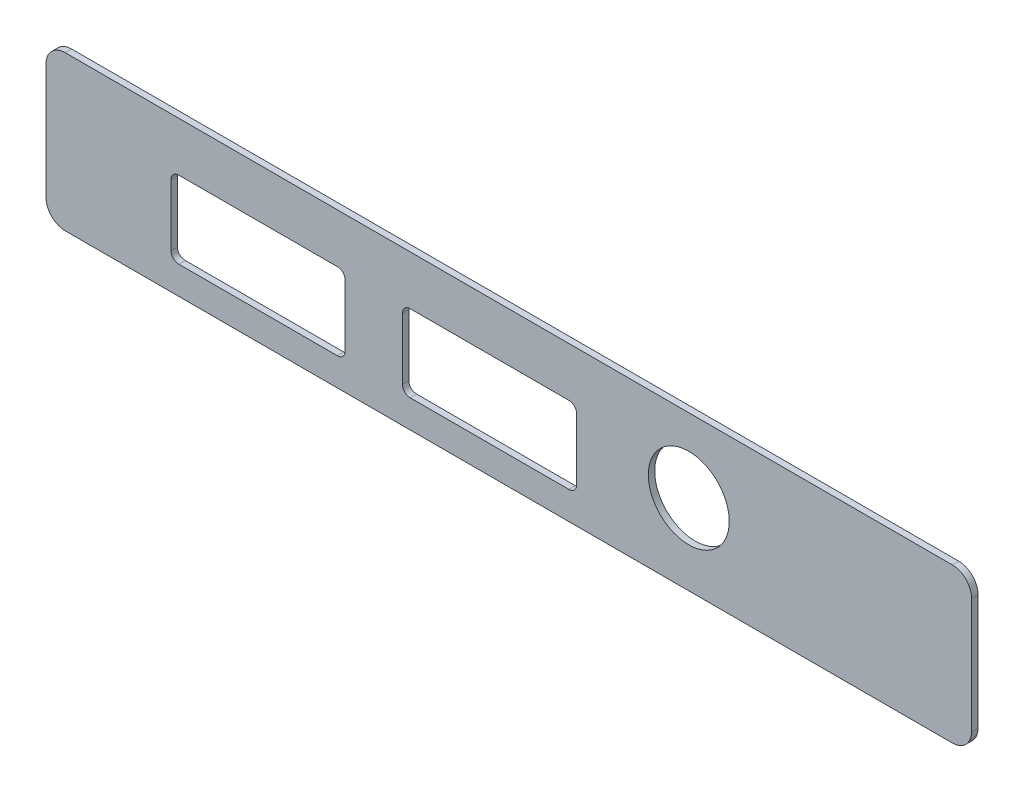
ISO-10303-21;
HEADER;
FILE_DESCRIPTION(('STEP AP214'),'2;1');
FILE_NAME('part.step','',(''),(''),'','','');
FILE_SCHEMA(('AUTOMOTIVE_DESIGN { 1 0 10303 214 1 1 1 1 }'));
ENDSEC;
DATA;
#1=APPLICATION_CONTEXT('core data for automotive mechanical design processes');
#2=APPLICATION_PROTOCOL_DEFINITION('international standard','automotive_design',2000,#1);
#3=PRODUCT_CONTEXT('',#1,'mechanical');
#4=PRODUCT('Part','Part','',(#3));
#5=PRODUCT_RELATED_PRODUCT_CATEGORY('part','',(#4));
#6=PRODUCT_DEFINITION_FORMATION('','',#4);
#7=PRODUCT_DEFINITION_CONTEXT('part definition',#1,'design');
#8=PRODUCT_DEFINITION('design','',#6,#7);
#9=PRODUCT_DEFINITION_SHAPE('','',#8);
#10=(LENGTH_UNIT() NAMED_UNIT(*) SI_UNIT(.MILLI.,.METRE.));
#11=(NAMED_UNIT(*) PLANE_ANGLE_UNIT() SI_UNIT($,.RADIAN.));
#12=(NAMED_UNIT(*) SI_UNIT($,.STERADIAN.) SOLID_ANGLE_UNIT());
#13=UNCERTAINTY_MEASURE_WITH_UNIT(LENGTH_MEASURE(1.E-05),#10,'distance_accuracy_value','');
#14=(GEOMETRIC_REPRESENTATION_CONTEXT(3) GLOBAL_UNCERTAINTY_ASSIGNED_CONTEXT((#13)) GLOBAL_UNIT_ASSIGNED_CONTEXT((#10,
#11,#12)) REPRESENTATION_CONTEXT('',''));
#15=CARTESIAN_POINT('',(0.,0.,0.));
#16=DIRECTION('',(0.,0.,1.));
#17=DIRECTION('',(1.,0.,0.));
#18=AXIS2_PLACEMENT_3D('',#15,#16,#17);
#19=CARTESIAN_POINT('',(0.,0.,55.5));
#20=DIRECTION('',(0.,0.,1.));
#21=DIRECTION('',(1.,0.,0.));
#22=AXIS2_PLACEMENT_3D('',#19,#20,#21);
#23=PLANE('',#22);
#24=DIRECTION('',(0.,1.,0.));
#25=VECTOR('',#24,1.);
#26=CARTESIAN_POINT('',(36.,4.5,55.5));
#27=LINE('',#26,#25);
#28=CARTESIAN_POINT('',(36.,13.5,55.5));
#29=VERTEX_POINT('',#28);
#30=CARTESIAN_POINT('',(36.,4.5,55.5));
#31=VERTEX_POINT('',#30);
#32=EDGE_CURVE('E385',#29,#31,#27,.F.);
#33=ORIENTED_EDGE('',*,*,#32,.F.);
#34=CARTESIAN_POINT('',(34.5,13.5,55.5));
#35=DIRECTION('',(0.,0.,1.));
#36=DIRECTION('',(1.,0.,0.));
#37=AXIS2_PLACEMENT_3D('',#34,#35,#36);
#38=CIRCLE('',#37,1.5);
#39=CARTESIAN_POINT('',(34.5,15.,55.5));
#40=VERTEX_POINT('',#39);
#41=EDGE_CURVE('E322',#40,#29,#38,.F.);
#42=ORIENTED_EDGE('',*,*,#41,.F.);
#43=DIRECTION('',(1.,0.,0.));
#44=VECTOR('',#43,1.);
#45=CARTESIAN_POINT('',(34.5,15.,55.5));
#46=LINE('',#45,#44);
#47=CARTESIAN_POINT('',(-34.5,15.,55.5));
#48=VERTEX_POINT('',#47);
#49=EDGE_CURVE('E339',#48,#40,#46,.T.);
#50=ORIENTED_EDGE('',*,*,#49,.F.);
#51=CARTESIAN_POINT('',(-34.5,13.5,55.5));
#52=DIRECTION('',(0.,0.,1.));
#53=DIRECTION('',(1.,0.,0.));
#54=AXIS2_PLACEMENT_3D('',#51,#52,#53);
#55=CIRCLE('',#54,1.5);
#56=CARTESIAN_POINT('',(-36.,13.5,55.5));
#57=VERTEX_POINT('',#56);
#58=EDGE_CURVE('E335',#57,#48,#55,.F.);
#59=ORIENTED_EDGE('',*,*,#58,.F.);
#60=DIRECTION('',(0.,1.,0.));
#61=VECTOR('',#60,1.);
#62=CARTESIAN_POINT('',(-36.,13.5,55.5));
#63=LINE('',#62,#61);
#64=CARTESIAN_POINT('',(-36.,4.5,55.5));
#65=VERTEX_POINT('',#64);
#66=EDGE_CURVE('E394',#65,#57,#63,.T.);
#67=ORIENTED_EDGE('',*,*,#66,.F.);
#68=CARTESIAN_POINT('',(-34.5,4.5,55.5));
#69=DIRECTION('',(0.,0.,1.));
#70=DIRECTION('',(1.,0.,0.));
#71=AXIS2_PLACEMENT_3D('',#68,#69,#70);
#72=CIRCLE('',#71,1.5);
#73=CARTESIAN_POINT('',(-34.5,3.,55.5));
#74=VERTEX_POINT('',#73);
#75=EDGE_CURVE('E330',#74,#65,#72,.F.);
#76=ORIENTED_EDGE('',*,*,#75,.F.);
#77=DIRECTION('',(1.,0.,0.));
#78=VECTOR('',#77,1.);
#79=CARTESIAN_POINT('',(-34.5,3.,55.5));
#80=LINE('',#79,#78);
#81=CARTESIAN_POINT('',(34.5,3.,55.5));
#82=VERTEX_POINT('',#81);
#83=EDGE_CURVE('E391',#82,#74,#80,.F.);
#84=ORIENTED_EDGE('',*,*,#83,.F.);
#85=CARTESIAN_POINT('',(34.5,4.5,55.5));
#86=DIRECTION('',(0.,0.,1.));
#87=DIRECTION('',(1.,0.,0.));
#88=AXIS2_PLACEMENT_3D('',#85,#86,#87);
#89=CIRCLE('',#88,1.5);
#90=EDGE_CURVE('E325',#31,#82,#89,.F.);
#91=ORIENTED_EDGE('',*,*,#90,.F.);
#92=EDGE_LOOP('',(#33,#42,#50,#59,#67,#76,#84,#91));
#93=FACE_BOUND('',#92,.T.);
#94=CARTESIAN_POINT('',(14.,9.25,55.5));
#95=DIRECTION('',(0.,0.,1.));
#96=DIRECTION('',(1.,0.,0.));
#97=AXIS2_PLACEMENT_3D('',#94,#95,#96);
#98=CIRCLE('',#97,3.15);
#99=CARTESIAN_POINT('',(17.15,9.25,55.5));
#100=VERTEX_POINT('',#99);
#101=EDGE_CURVE('E340',#100,#100,#98,.F.);
#102=ORIENTED_EDGE('',*,*,#101,.T.);
#103=EDGE_LOOP('',(#102));
#104=FACE_BOUND('',#103,.T.);
#105=CARTESIAN_POINT('',(4.675,10.57,55.5));
#106=DIRECTION('',(0.,0.,-1.));
#107=DIRECTION('',(-1.,0.,0.));
#108=AXIS2_PLACEMENT_3D('',#105,#106,#107);
#109=CIRCLE('',#108,0.6);
#110=CARTESIAN_POINT('',(4.675,11.17,55.5));
#111=VERTEX_POINT('',#110);
#112=CARTESIAN_POINT('',(5.275,10.57,55.5));
#113=VERTEX_POINT('',#112);
#114=EDGE_CURVE('E362',#111,#113,#109,.T.);
#115=ORIENTED_EDGE('',*,*,#114,.T.);
#116=DIRECTION('',(0.,1.,0.));
#117=VECTOR('',#116,1.);
#118=CARTESIAN_POINT('',(5.275,5.17,55.5));
#119=LINE('',#118,#117);
#120=CARTESIAN_POINT('',(5.275,5.77,55.5));
#121=VERTEX_POINT('',#120);
#122=EDGE_CURVE('E251',#113,#121,#119,.F.);
#123=ORIENTED_EDGE('',*,*,#122,.T.);
#124=CARTESIAN_POINT('',(4.675,5.77,55.5));
#125=DIRECTION('',(0.,0.,-1.));
#126=DIRECTION('',(-1.,0.,0.));
#127=AXIS2_PLACEMENT_3D('',#124,#125,#126);
#128=CIRCLE('',#127,0.6);
#129=CARTESIAN_POINT('',(4.675,5.17,55.5));
#130=VERTEX_POINT('',#129);
#131=EDGE_CURVE('E356',#121,#130,#128,.T.);
#132=ORIENTED_EDGE('',*,*,#131,.T.);
#133=DIRECTION('',(1.,0.,0.));
#134=VECTOR('',#133,1.);
#135=CARTESIAN_POINT('',(-8.275,5.17,55.5));
#136=LINE('',#135,#134);
#137=CARTESIAN_POINT('',(-7.675,5.17,55.5));
#138=VERTEX_POINT('',#137);
#139=EDGE_CURVE('E360',#130,#138,#136,.F.);
#140=ORIENTED_EDGE('',*,*,#139,.T.);
#141=CARTESIAN_POINT('',(-7.675,5.77,55.5));
#142=DIRECTION('',(0.,0.,-1.));
#143=DIRECTION('',(-1.,0.,0.));
#144=AXIS2_PLACEMENT_3D('',#141,#142,#143);
#145=CIRCLE('',#144,0.600000000000001);
#146=CARTESIAN_POINT('',(-8.275,5.77,55.5));
#147=VERTEX_POINT('',#146);
#148=EDGE_CURVE('E351',#138,#147,#145,.T.);
#149=ORIENTED_EDGE('',*,*,#148,.T.);
#150=DIRECTION('',(0.,1.,0.));
#151=VECTOR('',#150,1.);
#152=CARTESIAN_POINT('',(-8.275,11.17,55.5));
#153=LINE('',#152,#151);
#154=CARTESIAN_POINT('',(-8.275,10.57,55.5));
#155=VERTEX_POINT('',#154);
#156=EDGE_CURVE('E401',#147,#155,#153,.T.);
#157=ORIENTED_EDGE('',*,*,#156,.T.);
#158=CARTESIAN_POINT('',(-7.675,10.57,55.5));
#159=DIRECTION('',(0.,0.,-1.));
#160=DIRECTION('',(-1.,0.,0.));
#161=AXIS2_PLACEMENT_3D('',#158,#159,#160);
#162=CIRCLE('',#161,0.600000000000001);
#163=CARTESIAN_POINT('',(-7.675,11.17,55.5));
#164=VERTEX_POINT('',#163);
#165=EDGE_CURVE('E345',#155,#164,#162,.T.);
#166=ORIENTED_EDGE('',*,*,#165,.T.);
#167=DIRECTION('',(1.,0.,0.));
#168=VECTOR('',#167,1.);
#169=CARTESIAN_POINT('',(5.275,11.17,55.5));
#170=LINE('',#169,#168);
#171=EDGE_CURVE('E349',#164,#111,#170,.T.);
#172=ORIENTED_EDGE('',*,*,#171,.T.);
#173=EDGE_LOOP('',(#115,#123,#132,#140,#149,#157,#166,#172));
#174=FACE_BOUND('',#173,.T.);
#175=CARTESIAN_POINT('',(-13.325,5.77,55.5));
#176=DIRECTION('',(0.,0.,-1.));
#177=DIRECTION('',(-1.,0.,0.));
#178=AXIS2_PLACEMENT_3D('',#175,#176,#177);
#179=CIRCLE('',#178,0.6);
#180=CARTESIAN_POINT('',(-12.725,5.77,55.5));
#181=VERTEX_POINT('',#180);
#182=CARTESIAN_POINT('',(-13.325,5.17,55.5));
#183=VERTEX_POINT('',#182);
#184=EDGE_CURVE('E20',#181,#183,#179,.T.);
#185=ORIENTED_EDGE('',*,*,#184,.T.);
#186=DIRECTION('',(1.,0.,0.));
#187=VECTOR('',#186,1.);
#188=CARTESIAN_POINT('',(-26.275,5.17,55.5));
#189=LINE('',#188,#187);
#190=CARTESIAN_POINT('',(-25.675,5.17,55.5));
#191=VERTEX_POINT('',#190);
#192=EDGE_CURVE('E228',#183,#191,#189,.F.);
#193=ORIENTED_EDGE('',*,*,#192,.T.);
#194=CARTESIAN_POINT('',(-25.675,5.77,55.5));
#195=DIRECTION('',(0.,0.,-1.));
#196=DIRECTION('',(-1.,0.,0.));
#197=AXIS2_PLACEMENT_3D('',#194,#195,#196);
#198=CIRCLE('',#197,0.6);
#199=CARTESIAN_POINT('',(-26.275,5.77,55.5));
#200=VERTEX_POINT('',#199);
#201=EDGE_CURVE('E368',#191,#200,#198,.T.);
#202=ORIENTED_EDGE('',*,*,#201,.T.);
#203=DIRECTION('',(0.,1.,0.));
#204=VECTOR('',#203,1.);
#205=CARTESIAN_POINT('',(-26.275,11.17,55.5));
#206=LINE('',#205,#204);
#207=CARTESIAN_POINT('',(-26.275,10.57,55.5));
#208=VERTEX_POINT('',#207);
#209=EDGE_CURVE('E258',#200,#208,#206,.T.);
#210=ORIENTED_EDGE('',*,*,#209,.T.);
#211=CARTESIAN_POINT('',(-25.675,10.57,55.5));
#212=DIRECTION('',(0.,0.,-1.));
#213=DIRECTION('',(-1.,0.,0.));
#214=AXIS2_PLACEMENT_3D('',#211,#212,#213);
#215=CIRCLE('',#214,0.6);
#216=CARTESIAN_POINT('',(-25.675,11.17,55.5));
#217=VERTEX_POINT('',#216);
#218=EDGE_CURVE('E257',#208,#217,#215,.T.);
#219=ORIENTED_EDGE('',*,*,#218,.T.);
#220=DIRECTION('',(1.,0.,0.));
#221=VECTOR('',#220,1.);
#222=CARTESIAN_POINT('',(-12.725,11.17,55.5));
#223=LINE('',#222,#221);
#224=CARTESIAN_POINT('',(-13.325,11.17,55.5));
#225=VERTEX_POINT('',#224);
#226=EDGE_CURVE('E253',#217,#225,#223,.T.);
#227=ORIENTED_EDGE('',*,*,#226,.T.);
#228=CARTESIAN_POINT('',(-13.325,10.57,55.5));
#229=DIRECTION('',(0.,0.,-1.));
#230=DIRECTION('',(-1.,0.,0.));
#231=AXIS2_PLACEMENT_3D('',#228,#229,#230);
#232=CIRCLE('',#231,0.6);
#233=CARTESIAN_POINT('',(-12.725,10.57,55.5));
#234=VERTEX_POINT('',#233);
#235=EDGE_CURVE('E239',#225,#234,#232,.T.);
#236=ORIENTED_EDGE('',*,*,#235,.T.);
#237=DIRECTION('',(0.,1.,0.));
#238=VECTOR('',#237,1.);
#239=CARTESIAN_POINT('',(-12.725,5.17,55.5));
#240=LINE('',#239,#238);
#241=EDGE_CURVE('E231',#234,#181,#240,.F.);
#242=ORIENTED_EDGE('',*,*,#241,.T.);
#243=EDGE_LOOP('',(#185,#193,#202,#210,#219,#227,#236,#242));
#244=FACE_BOUND('',#243,.T.);
#245=ADVANCED_FACE('F17',(#93,#104,#174,#244),#23,.T.);
#246=CARTESIAN_POINT('',(-13.325,5.77,55.61453877827));
#247=DIRECTION('',(0.,0.,-1.));
#248=DIRECTION('',(-1.,0.,0.));
#249=AXIS2_PLACEMENT_3D('',#246,#247,#248);
#250=CYLINDRICAL_SURFACE('',#249,0.6);
#251=ORIENTED_EDGE('',*,*,#184,.F.);
#252=DIRECTION('',(0.,0.,-1.));
#253=VECTOR('',#252,1.);
#254=CARTESIAN_POINT('',(-12.725,5.77,0.));
#255=LINE('',#254,#253);
#256=CARTESIAN_POINT('',(-12.725,5.77,55.));
#257=VERTEX_POINT('',#256);
#258=EDGE_CURVE('E222',#181,#257,#255,.T.);
#259=ORIENTED_EDGE('',*,*,#258,.T.);
#260=CARTESIAN_POINT('',(-13.325,5.77,55.));
#261=DIRECTION('',(0.,0.,-1.));
#262=DIRECTION('',(-1.,0.,0.));
#263=AXIS2_PLACEMENT_3D('',#260,#261,#262);
#264=CIRCLE('',#263,0.6);
#265=CARTESIAN_POINT('',(-13.325,5.17,55.));
#266=VERTEX_POINT('',#265);
#267=EDGE_CURVE('E319',#257,#266,#264,.T.);
#268=ORIENTED_EDGE('',*,*,#267,.T.);
#269=DIRECTION('',(0.,0.,-1.));
#270=VECTOR('',#269,1.);
#271=CARTESIAN_POINT('',(-13.325,5.17,0.));
#272=LINE('',#271,#270);
#273=EDGE_CURVE('E224',#266,#183,#272,.F.);
#274=ORIENTED_EDGE('',*,*,#273,.T.);
#275=EDGE_LOOP('',(#251,#259,#268,#274));
#276=FACE_BOUND('',#275,.T.);
#277=ADVANCED_FACE('F220',(#276),#250,.F.);
#278=CARTESIAN_POINT('',(-26.275,5.17,0.));
#279=DIRECTION('',(0.,-1.,0.));
#280=DIRECTION('',(0.,0.,-1.));
#281=AXIS2_PLACEMENT_3D('',#278,#279,#280);
#282=PLANE('',#281);
#283=DIRECTION('',(1.,0.,0.));
#284=VECTOR('',#283,1.);
#285=CARTESIAN_POINT('',(0.,5.17,55.));
#286=LINE('',#285,#284);
#287=CARTESIAN_POINT('',(-25.675,5.17,55.));
#288=VERTEX_POINT('',#287);
#289=EDGE_CURVE('E318',#266,#288,#286,.F.);
#290=ORIENTED_EDGE('',*,*,#289,.T.);
#291=DIRECTION('',(0.,0.,-1.));
#292=VECTOR('',#291,1.);
#293=CARTESIAN_POINT('',(-25.675,5.17,55.61453877827));
#294=LINE('',#293,#292);
#295=EDGE_CURVE('E370',#288,#191,#294,.F.);
#296=ORIENTED_EDGE('',*,*,#295,.T.);
#297=ORIENTED_EDGE('',*,*,#192,.F.);
#298=ORIENTED_EDGE('',*,*,#273,.F.);
#299=EDGE_LOOP('',(#290,#296,#297,#298));
#300=FACE_BOUND('',#299,.T.);
#301=ADVANCED_FACE('F729',(#300),#282,.F.);
#302=CARTESIAN_POINT('',(-25.675,5.77,55.61453877827));
#303=DIRECTION('',(0.,0.,-1.));
#304=DIRECTION('',(-1.,0.,0.));
#305=AXIS2_PLACEMENT_3D('',#302,#303,#304);
#306=CYLINDRICAL_SURFACE('',#305,0.6);
#307=ORIENTED_EDGE('',*,*,#201,.F.);
#308=ORIENTED_EDGE('',*,*,#295,.F.);
#309=CARTESIAN_POINT('',(-25.675,5.77,55.));
#310=DIRECTION('',(0.,0.,-1.));
#311=DIRECTION('',(-1.,0.,0.));
#312=AXIS2_PLACEMENT_3D('',#309,#310,#311);
#313=CIRCLE('',#312,0.6);
#314=CARTESIAN_POINT('',(-26.275,5.77,55.));
#315=VERTEX_POINT('',#314);
#316=EDGE_CURVE('E314',#288,#315,#313,.T.);
#317=ORIENTED_EDGE('',*,*,#316,.T.);
#318=DIRECTION('',(0.,0.,1.));
#319=VECTOR('',#318,1.);
#320=CARTESIAN_POINT('',(-26.275,5.77,0.));
#321=LINE('',#320,#319);
#322=EDGE_CURVE('E262',#315,#200,#321,.T.);
#323=ORIENTED_EDGE('',*,*,#322,.T.);
#324=EDGE_LOOP('',(#307,#308,#317,#323));
#325=FACE_BOUND('',#324,.T.);
#326=ADVANCED_FACE('F721',(#325),#306,.F.);
#327=CARTESIAN_POINT('',(-26.275,11.17,0.));
#328=DIRECTION('',(-1.,0.,0.));
#329=DIRECTION('',(0.,0.,1.));
#330=AXIS2_PLACEMENT_3D('',#327,#328,#329);
#331=PLANE('',#330);
#332=ORIENTED_EDGE('',*,*,#209,.F.);
#333=ORIENTED_EDGE('',*,*,#322,.F.);
#334=DIRECTION('',(0.,1.,0.));
#335=VECTOR('',#334,1.);
#336=CARTESIAN_POINT('',(-26.275,0.,55.));
#337=LINE('',#336,#335);
#338=CARTESIAN_POINT('',(-26.275,10.57,55.));
#339=VERTEX_POINT('',#338);
#340=EDGE_CURVE('E313',#315,#339,#337,.T.);
#341=ORIENTED_EDGE('',*,*,#340,.T.);
#342=DIRECTION('',(0.,0.,-1.));
#343=VECTOR('',#342,1.);
#344=CARTESIAN_POINT('',(-26.275,10.57,55.61453877827));
#345=LINE('',#344,#343);
#346=EDGE_CURVE('E261',#339,#208,#345,.F.);
#347=ORIENTED_EDGE('',*,*,#346,.T.);
#348=EDGE_LOOP('',(#332,#333,#341,#347));
#349=FACE_BOUND('',#348,.T.);
#350=ADVANCED_FACE('F436',(#349),#331,.F.);
#351=CARTESIAN_POINT('',(-25.675,10.57,55.61453877827));
#352=DIRECTION('',(0.,0.,-1.));
#353=DIRECTION('',(-1.,0.,0.));
#354=AXIS2_PLACEMENT_3D('',#351,#352,#353);
#355=CYLINDRICAL_SURFACE('',#354,0.6);
#356=ORIENTED_EDGE('',*,*,#218,.F.);
#357=ORIENTED_EDGE('',*,*,#346,.F.);
#358=CARTESIAN_POINT('',(-25.675,10.57,55.));
#359=DIRECTION('',(0.,0.,-1.));
#360=DIRECTION('',(-1.,0.,0.));
#361=AXIS2_PLACEMENT_3D('',#358,#359,#360);
#362=CIRCLE('',#361,0.6);
#363=CARTESIAN_POINT('',(-25.675,11.17,55.));
#364=VERTEX_POINT('',#363);
#365=EDGE_CURVE('E309',#339,#364,#362,.T.);
#366=ORIENTED_EDGE('',*,*,#365,.T.);
#367=DIRECTION('',(0.,0.,1.));
#368=VECTOR('',#367,1.);
#369=CARTESIAN_POINT('',(-25.675,11.17,0.));
#370=LINE('',#369,#368);
#371=EDGE_CURVE('E256',#364,#217,#370,.T.);
#372=ORIENTED_EDGE('',*,*,#371,.T.);
#373=EDGE_LOOP('',(#356,#357,#366,#372));
#374=FACE_BOUND('',#373,.T.);
#375=ADVANCED_FACE('F441',(#374),#355,.F.);
#376=CARTESIAN_POINT('',(-12.725,11.17,0.));
#377=DIRECTION('',(0.,1.,0.));
#378=DIRECTION('',(0.,0.,1.));
#379=AXIS2_PLACEMENT_3D('',#376,#377,#378);
#380=PLANE('',#379);
#381=DIRECTION('',(1.,0.,0.));
#382=VECTOR('',#381,1.);
#383=CARTESIAN_POINT('',(0.,11.17,55.));
#384=LINE('',#383,#382);
#385=CARTESIAN_POINT('',(-13.325,11.17,55.));
#386=VERTEX_POINT('',#385);
#387=EDGE_CURVE('E308',#364,#386,#384,.T.);
#388=ORIENTED_EDGE('',*,*,#387,.T.);
#389=DIRECTION('',(0.,0.,-1.));
#390=VECTOR('',#389,1.);
#391=CARTESIAN_POINT('',(-13.325,11.17,55.61453877827));
#392=LINE('',#391,#390);
#393=EDGE_CURVE('E247',#386,#225,#392,.F.);
#394=ORIENTED_EDGE('',*,*,#393,.T.);
#395=ORIENTED_EDGE('',*,*,#226,.F.);
#396=ORIENTED_EDGE('',*,*,#371,.F.);
#397=EDGE_LOOP('',(#388,#394,#395,#396));
#398=FACE_BOUND('',#397,.T.);
#399=ADVANCED_FACE('F698',(#398),#380,.F.);
#400=CARTESIAN_POINT('',(-13.325,10.57,55.61453877827));
#401=DIRECTION('',(0.,0.,-1.));
#402=DIRECTION('',(-1.,0.,0.));
#403=AXIS2_PLACEMENT_3D('',#400,#401,#402);
#404=CYLINDRICAL_SURFACE('',#403,0.6);
#405=ORIENTED_EDGE('',*,*,#235,.F.);
#406=ORIENTED_EDGE('',*,*,#393,.F.);
#407=CARTESIAN_POINT('',(-13.325,10.57,55.));
#408=DIRECTION('',(0.,0.,-1.));
#409=DIRECTION('',(-1.,0.,0.));
#410=AXIS2_PLACEMENT_3D('',#407,#408,#409);
#411=CIRCLE('',#410,0.6);
#412=CARTESIAN_POINT('',(-12.725,10.57,55.));
#413=VERTEX_POINT('',#412);
#414=EDGE_CURVE('E304',#386,#413,#411,.T.);
#415=ORIENTED_EDGE('',*,*,#414,.T.);
#416=DIRECTION('',(0.,0.,-1.));
#417=VECTOR('',#416,1.);
#418=CARTESIAN_POINT('',(-12.725,10.57,0.));
#419=LINE('',#418,#417);
#420=EDGE_CURVE('E236',#413,#234,#419,.F.);
#421=ORIENTED_EDGE('',*,*,#420,.T.);
#422=EDGE_LOOP('',(#405,#406,#415,#421));
#423=FACE_BOUND('',#422,.T.);
#424=ADVANCED_FACE('F690',(#423),#404,.F.);
#425=CARTESIAN_POINT('',(-12.725,5.17,0.));
#426=DIRECTION('',(1.,0.,0.));
#427=DIRECTION('',(0.,0.,-1.));
#428=AXIS2_PLACEMENT_3D('',#425,#426,#427);
#429=PLANE('',#428);
#430=DIRECTION('',(0.,1.,0.));
#431=VECTOR('',#430,1.);
#432=CARTESIAN_POINT('',(-12.725,0.,55.));
#433=LINE('',#432,#431);
#434=EDGE_CURVE('E234',#413,#257,#433,.F.);
#435=ORIENTED_EDGE('',*,*,#434,.T.);
#436=ORIENTED_EDGE('',*,*,#258,.F.);
#437=ORIENTED_EDGE('',*,*,#241,.F.);
#438=ORIENTED_EDGE('',*,*,#420,.F.);
#439=EDGE_LOOP('',(#435,#436,#437,#438));
#440=FACE_BOUND('',#439,.T.);
#441=ADVANCED_FACE('F230',(#440),#429,.F.);
#442=CARTESIAN_POINT('',(4.675,10.57,55.61453877827));
#443=DIRECTION('',(0.,0.,-1.));
#444=DIRECTION('',(-1.,0.,0.));
#445=AXIS2_PLACEMENT_3D('',#442,#443,#444);
#446=CYLINDRICAL_SURFACE('',#445,0.6);
#447=ORIENTED_EDGE('',*,*,#114,.F.);
#448=DIRECTION('',(0.,0.,1.));
#449=VECTOR('',#448,1.);
#450=CARTESIAN_POINT('',(4.675,11.17,0.));
#451=LINE('',#450,#449);
#452=CARTESIAN_POINT('',(4.675,11.17,55.));
#453=VERTEX_POINT('',#452);
#454=EDGE_CURVE('E400',#111,#453,#451,.F.);
#455=ORIENTED_EDGE('',*,*,#454,.T.);
#456=CARTESIAN_POINT('',(4.675,10.57,55.));
#457=DIRECTION('',(0.,0.,-1.));
#458=DIRECTION('',(-1.,0.,0.));
#459=AXIS2_PLACEMENT_3D('',#456,#457,#458);
#460=CIRCLE('',#459,0.6);
#461=CARTESIAN_POINT('',(5.275,10.57,55.));
#462=VERTEX_POINT('',#461);
#463=EDGE_CURVE('E300',#453,#462,#460,.T.);
#464=ORIENTED_EDGE('',*,*,#463,.T.);
#465=DIRECTION('',(0.,0.,-1.));
#466=VECTOR('',#465,1.);
#467=CARTESIAN_POINT('',(5.275,10.57,0.));
#468=LINE('',#467,#466);
#469=EDGE_CURVE('E421',#462,#113,#468,.F.);
#470=ORIENTED_EDGE('',*,*,#469,.T.);
#471=EDGE_LOOP('',(#447,#455,#464,#470));
#472=FACE_BOUND('',#471,.T.);
#473=ADVANCED_FACE('F508',(#472),#446,.F.);
#474=CARTESIAN_POINT('',(5.275,5.17,0.));
#475=DIRECTION('',(1.,0.,0.));
#476=DIRECTION('',(0.,0.,-1.));
#477=AXIS2_PLACEMENT_3D('',#474,#475,#476);
#478=PLANE('',#477);
#479=DIRECTION('',(0.,1.,0.));
#480=VECTOR('',#479,1.);
#481=CARTESIAN_POINT('',(5.275,0.,55.));
#482=LINE('',#481,#480);
#483=CARTESIAN_POINT('',(5.275,5.77,55.));
#484=VERTEX_POINT('',#483);
#485=EDGE_CURVE('E299',#462,#484,#482,.F.);
#486=ORIENTED_EDGE('',*,*,#485,.T.);
#487=DIRECTION('',(0.,0.,-1.));
#488=VECTOR('',#487,1.);
#489=CARTESIAN_POINT('',(5.275,5.77,55.61453877827));
#490=LINE('',#489,#488);
#491=EDGE_CURVE('E361',#484,#121,#490,.F.);
#492=ORIENTED_EDGE('',*,*,#491,.T.);
#493=ORIENTED_EDGE('',*,*,#122,.F.);
#494=ORIENTED_EDGE('',*,*,#469,.F.);
#495=EDGE_LOOP('',(#486,#492,#493,#494));
#496=FACE_BOUND('',#495,.T.);
#497=ADVANCED_FACE('F505',(#496),#478,.F.);
#498=CARTESIAN_POINT('',(4.675,5.77,55.61453877827));
#499=DIRECTION('',(0.,0.,-1.));
#500=DIRECTION('',(-1.,0.,0.));
#501=AXIS2_PLACEMENT_3D('',#498,#499,#500);
#502=CYLINDRICAL_SURFACE('',#501,0.6);
#503=ORIENTED_EDGE('',*,*,#131,.F.);
#504=ORIENTED_EDGE('',*,*,#491,.F.);
#505=CARTESIAN_POINT('',(4.675,5.77,55.));
#506=DIRECTION('',(0.,0.,-1.));
#507=DIRECTION('',(-1.,0.,0.));
#508=AXIS2_PLACEMENT_3D('',#505,#506,#507);
#509=CIRCLE('',#508,0.6);
#510=CARTESIAN_POINT('',(4.675,5.17,55.));
#511=VERTEX_POINT('',#510);
#512=EDGE_CURVE('E295',#484,#511,#509,.T.);
#513=ORIENTED_EDGE('',*,*,#512,.T.);
#514=DIRECTION('',(0.,0.,-1.));
#515=VECTOR('',#514,1.);
#516=CARTESIAN_POINT('',(4.675,5.17,0.));
#517=LINE('',#516,#515);
#518=EDGE_CURVE('E404',#511,#130,#517,.F.);
#519=ORIENTED_EDGE('',*,*,#518,.T.);
#520=EDGE_LOOP('',(#503,#504,#513,#519));
#521=FACE_BOUND('',#520,.T.);
#522=ADVANCED_FACE('F516',(#521),#502,.F.);
#523=CARTESIAN_POINT('',(-8.275,5.17,0.));
#524=DIRECTION('',(0.,-1.,0.));
#525=DIRECTION('',(0.,0.,-1.));
#526=AXIS2_PLACEMENT_3D('',#523,#524,#525);
#527=PLANE('',#526);
#528=DIRECTION('',(1.,0.,0.));
#529=VECTOR('',#528,1.);
#530=CARTESIAN_POINT('',(0.,5.17,55.));
#531=LINE('',#530,#529);
#532=CARTESIAN_POINT('',(-7.675,5.17,55.));
#533=VERTEX_POINT('',#532);
#534=EDGE_CURVE('E294',#511,#533,#531,.F.);
#535=ORIENTED_EDGE('',*,*,#534,.T.);
#536=DIRECTION('',(0.,0.,-1.));
#537=VECTOR('',#536,1.);
#538=CARTESIAN_POINT('',(-7.675,5.17,55.61453877827));
#539=LINE('',#538,#537);
#540=EDGE_CURVE('E355',#533,#138,#539,.F.);
#541=ORIENTED_EDGE('',*,*,#540,.T.);
#542=ORIENTED_EDGE('',*,*,#139,.F.);
#543=ORIENTED_EDGE('',*,*,#518,.F.);
#544=EDGE_LOOP('',(#535,#541,#542,#543));
#545=FACE_BOUND('',#544,.T.);
#546=ADVANCED_FACE('F518',(#545),#527,.F.);
#547=CARTESIAN_POINT('',(-7.675,5.77,55.61453877827));
#548=DIRECTION('',(0.,0.,-1.));
#549=DIRECTION('',(-1.,0.,0.));
#550=AXIS2_PLACEMENT_3D('',#547,#548,#549);
#551=CYLINDRICAL_SURFACE('',#550,0.600000000000001);
#552=ORIENTED_EDGE('',*,*,#148,.F.);
#553=ORIENTED_EDGE('',*,*,#540,.F.);
#554=CARTESIAN_POINT('',(-7.675,5.77,55.));
#555=DIRECTION('',(0.,0.,-1.));
#556=DIRECTION('',(-1.,0.,0.));
#557=AXIS2_PLACEMENT_3D('',#554,#555,#556);
#558=CIRCLE('',#557,0.600000000000001);
#559=CARTESIAN_POINT('',(-8.275,5.77,55.));
#560=VERTEX_POINT('',#559);
#561=EDGE_CURVE('E290',#533,#560,#558,.T.);
#562=ORIENTED_EDGE('',*,*,#561,.T.);
#563=DIRECTION('',(0.,0.,1.));
#564=VECTOR('',#563,1.);
#565=CARTESIAN_POINT('',(-8.275,5.77,0.));
#566=LINE('',#565,#564);
#567=EDGE_CURVE('E354',#560,#147,#566,.T.);
#568=ORIENTED_EDGE('',*,*,#567,.T.);
#569=EDGE_LOOP('',(#552,#553,#562,#568));
#570=FACE_BOUND('',#569,.T.);
#571=ADVANCED_FACE('F483',(#570),#551,.F.);
#572=CARTESIAN_POINT('',(-8.275,11.17,0.));
#573=DIRECTION('',(-1.,0.,0.));
#574=DIRECTION('',(0.,0.,1.));
#575=AXIS2_PLACEMENT_3D('',#572,#573,#574);
#576=PLANE('',#575);
#577=ORIENTED_EDGE('',*,*,#156,.F.);
#578=ORIENTED_EDGE('',*,*,#567,.F.);
#579=DIRECTION('',(0.,1.,0.));
#580=VECTOR('',#579,1.);
#581=CARTESIAN_POINT('',(-8.275,0.,55.));
#582=LINE('',#581,#580);
#583=CARTESIAN_POINT('',(-8.275,10.57,55.));
#584=VERTEX_POINT('',#583);
#585=EDGE_CURVE('E289',#560,#584,#582,.T.);
#586=ORIENTED_EDGE('',*,*,#585,.T.);
#587=DIRECTION('',(0.,0.,-1.));
#588=VECTOR('',#587,1.);
#589=CARTESIAN_POINT('',(-8.275,10.57,55.61453877827));
#590=LINE('',#589,#588);
#591=EDGE_CURVE('E350',#584,#155,#590,.F.);
#592=ORIENTED_EDGE('',*,*,#591,.T.);
#593=EDGE_LOOP('',(#577,#578,#586,#592));
#594=FACE_BOUND('',#593,.T.);
#595=ADVANCED_FACE('F489',(#594),#576,.F.);
#596=CARTESIAN_POINT('',(-7.675,10.57,55.61453877827));
#597=DIRECTION('',(0.,0.,-1.));
#598=DIRECTION('',(-1.,0.,0.));
#599=AXIS2_PLACEMENT_3D('',#596,#597,#598);
#600=CYLINDRICAL_SURFACE('',#599,0.600000000000001);
#601=ORIENTED_EDGE('',*,*,#165,.F.);
#602=ORIENTED_EDGE('',*,*,#591,.F.);
#603=CARTESIAN_POINT('',(-7.675,10.57,55.));
#604=DIRECTION('',(0.,0.,-1.));
#605=DIRECTION('',(-1.,0.,0.));
#606=AXIS2_PLACEMENT_3D('',#603,#604,#605);
#607=CIRCLE('',#606,0.600000000000001);
#608=CARTESIAN_POINT('',(-7.675,11.17,55.));
#609=VERTEX_POINT('',#608);
#610=EDGE_CURVE('E285',#584,#609,#607,.T.);
#611=ORIENTED_EDGE('',*,*,#610,.T.);
#612=DIRECTION('',(0.,0.,1.));
#613=VECTOR('',#612,1.);
#614=CARTESIAN_POINT('',(-7.675,11.17,0.));
#615=LINE('',#614,#613);
#616=EDGE_CURVE('E344',#609,#164,#615,.T.);
#617=ORIENTED_EDGE('',*,*,#616,.T.);
#618=EDGE_LOOP('',(#601,#602,#611,#617));
#619=FACE_BOUND('',#618,.T.);
#620=ADVANCED_FACE('F574',(#619),#600,.F.);
#621=CARTESIAN_POINT('',(5.275,11.17,0.));
#622=DIRECTION('',(0.,1.,0.));
#623=DIRECTION('',(0.,0.,1.));
#624=AXIS2_PLACEMENT_3D('',#621,#622,#623);
#625=PLANE('',#624);
#626=DIRECTION('',(1.,0.,0.));
#627=VECTOR('',#626,1.);
#628=CARTESIAN_POINT('',(0.,11.17,55.));
#629=LINE('',#628,#627);
#630=EDGE_CURVE('E284',#609,#453,#629,.T.);
#631=ORIENTED_EDGE('',*,*,#630,.T.);
#632=ORIENTED_EDGE('',*,*,#454,.F.);
#633=ORIENTED_EDGE('',*,*,#171,.F.);
#634=ORIENTED_EDGE('',*,*,#616,.F.);
#635=EDGE_LOOP('',(#631,#632,#633,#634));
#636=FACE_BOUND('',#635,.T.);
#637=ADVANCED_FACE('F512',(#636),#625,.F.);
#638=CARTESIAN_POINT('',(14.,9.25,0.));
#639=DIRECTION('',(0.,0.,1.));
#640=DIRECTION('',(1.,0.,0.));
#641=AXIS2_PLACEMENT_3D('',#638,#639,#640);
#642=CYLINDRICAL_SURFACE('',#641,3.15);
#643=CARTESIAN_POINT('',(14.,9.25,55.));
#644=DIRECTION('',(0.,0.,1.));
#645=DIRECTION('',(1.,0.,0.));
#646=AXIS2_PLACEMENT_3D('',#643,#644,#645);
#647=CIRCLE('',#646,3.15);
#648=CARTESIAN_POINT('',(17.15,9.25,55.));
#649=VERTEX_POINT('',#648);
#650=EDGE_CURVE('E280',#649,#649,#647,.F.);
#651=ORIENTED_EDGE('',*,*,#650,.T.);
#652=EDGE_LOOP('',(#651));
#653=FACE_BOUND('',#652,.T.);
#654=ORIENTED_EDGE('',*,*,#101,.F.);
#655=EDGE_LOOP('',(#654));
#656=FACE_BOUND('',#655,.T.);
#657=ADVANCED_FACE('F567',(#653,#656),#642,.F.);
#658=CARTESIAN_POINT('',(34.5,15.,55.5));
#659=DIRECTION('',(0.,1.,0.));
#660=DIRECTION('',(0.,0.,1.));
#661=AXIS2_PLACEMENT_3D('',#658,#659,#660);
#662=PLANE('',#661);
#663=DIRECTION('',(0.,0.,1.));
#664=VECTOR('',#663,1.);
#665=CARTESIAN_POINT('',(34.5,15.,55.5));
#666=LINE('',#665,#664);
#667=CARTESIAN_POINT('',(34.5,15.,55.));
#668=VERTEX_POINT('',#667);
#669=EDGE_CURVE('E324',#668,#40,#666,.T.);
#670=ORIENTED_EDGE('',*,*,#669,.F.);
#671=DIRECTION('',(1.,0.,0.));
#672=VECTOR('',#671,1.);
#673=CARTESIAN_POINT('',(0.,15.,55.));
#674=LINE('',#673,#672);
#675=CARTESIAN_POINT('',(-34.5,15.,55.));
#676=VERTEX_POINT('',#675);
#677=EDGE_CURVE('E279',#668,#676,#674,.F.);
#678=ORIENTED_EDGE('',*,*,#677,.T.);
#679=DIRECTION('',(0.,0.,1.));
#680=VECTOR('',#679,1.);
#681=CARTESIAN_POINT('',(-34.5,15.,55.5));
#682=LINE('',#681,#680);
#683=EDGE_CURVE('E338',#48,#676,#682,.F.);
#684=ORIENTED_EDGE('',*,*,#683,.F.);
#685=ORIENTED_EDGE('',*,*,#49,.T.);
#686=EDGE_LOOP('',(#670,#678,#684,#685));
#687=FACE_BOUND('',#686,.T.);
#688=ADVANCED_FACE('F563',(#687),#662,.T.);
#689=CARTESIAN_POINT('',(-34.5,13.5,55.5));
#690=DIRECTION('',(0.,0.,1.));
#691=DIRECTION('',(1.,0.,0.));
#692=AXIS2_PLACEMENT_3D('',#689,#690,#691);
#693=CYLINDRICAL_SURFACE('',#692,1.5);
#694=ORIENTED_EDGE('',*,*,#683,.T.);
#695=CARTESIAN_POINT('',(-34.5,13.5,55.));
#696=DIRECTION('',(0.,0.,1.));
#697=DIRECTION('',(1.,0.,0.));
#698=AXIS2_PLACEMENT_3D('',#695,#696,#697);
#699=CIRCLE('',#698,1.5);
#700=CARTESIAN_POINT('',(-36.,13.5,55.));
#701=VERTEX_POINT('',#700);
#702=EDGE_CURVE('E275',#676,#701,#699,.T.);
#703=ORIENTED_EDGE('',*,*,#702,.T.);
#704=DIRECTION('',(0.,0.,1.));
#705=VECTOR('',#704,1.);
#706=CARTESIAN_POINT('',(-36.,13.5,55.5));
#707=LINE('',#706,#705);
#708=EDGE_CURVE('E334',#57,#701,#707,.F.);
#709=ORIENTED_EDGE('',*,*,#708,.F.);
#710=ORIENTED_EDGE('',*,*,#58,.T.);
#711=EDGE_LOOP('',(#694,#703,#709,#710));
#712=FACE_BOUND('',#711,.T.);
#713=ADVANCED_FACE('F559',(#712),#693,.T.);
#714=CARTESIAN_POINT('',(-36.,13.5,55.5));
#715=DIRECTION('',(-1.,0.,0.));
#716=DIRECTION('',(0.,0.,1.));
#717=AXIS2_PLACEMENT_3D('',#714,#715,#716);
#718=PLANE('',#717);
#719=ORIENTED_EDGE('',*,*,#708,.T.);
#720=DIRECTION('',(0.,1.,0.));
#721=VECTOR('',#720,1.);
#722=CARTESIAN_POINT('',(-36.,0.,55.));
#723=LINE('',#722,#721);
#724=CARTESIAN_POINT('',(-36.,4.5,55.));
#725=VERTEX_POINT('',#724);
#726=EDGE_CURVE('E274',#701,#725,#723,.F.);
#727=ORIENTED_EDGE('',*,*,#726,.T.);
#728=DIRECTION('',(0.,0.,1.));
#729=VECTOR('',#728,1.);
#730=CARTESIAN_POINT('',(-36.,4.5,55.5));
#731=LINE('',#730,#729);
#732=EDGE_CURVE('E333',#65,#725,#731,.F.);
#733=ORIENTED_EDGE('',*,*,#732,.F.);
#734=ORIENTED_EDGE('',*,*,#66,.T.);
#735=EDGE_LOOP('',(#719,#727,#733,#734));
#736=FACE_BOUND('',#735,.T.);
#737=ADVANCED_FACE('F555',(#736),#718,.T.);
#738=CARTESIAN_POINT('',(-34.5,4.5,55.5));
#739=DIRECTION('',(0.,0.,1.));
#740=DIRECTION('',(1.,0.,0.));
#741=AXIS2_PLACEMENT_3D('',#738,#739,#740);
#742=CYLINDRICAL_SURFACE('',#741,1.5);
#743=ORIENTED_EDGE('',*,*,#732,.T.);
#744=CARTESIAN_POINT('',(-34.5,4.5,55.));
#745=DIRECTION('',(0.,0.,1.));
#746=DIRECTION('',(1.,0.,0.));
#747=AXIS2_PLACEMENT_3D('',#744,#745,#746);
#748=CIRCLE('',#747,1.5);
#749=CARTESIAN_POINT('',(-34.5,3.,55.));
#750=VERTEX_POINT('',#749);
#751=EDGE_CURVE('E270',#725,#750,#748,.T.);
#752=ORIENTED_EDGE('',*,*,#751,.T.);
#753=DIRECTION('',(0.,0.,-1.));
#754=VECTOR('',#753,1.);
#755=CARTESIAN_POINT('',(-34.5,3.,55.5));
#756=LINE('',#755,#754);
#757=EDGE_CURVE('E329',#74,#750,#756,.T.);
#758=ORIENTED_EDGE('',*,*,#757,.F.);
#759=ORIENTED_EDGE('',*,*,#75,.T.);
#760=EDGE_LOOP('',(#743,#752,#758,#759));
#761=FACE_BOUND('',#760,.T.);
#762=ADVANCED_FACE('F551',(#761),#742,.T.);
#763=CARTESIAN_POINT('',(-34.5,3.,55.5));
#764=DIRECTION('',(0.,-1.,0.));
#765=DIRECTION('',(0.,0.,-1.));
#766=AXIS2_PLACEMENT_3D('',#763,#764,#765);
#767=PLANE('',#766);
#768=ORIENTED_EDGE('',*,*,#757,.T.);
#769=DIRECTION('',(1.,0.,0.));
#770=VECTOR('',#769,1.);
#771=CARTESIAN_POINT('',(0.,3.,55.));
#772=LINE('',#771,#770);
#773=CARTESIAN_POINT('',(34.5,3.,55.));
#774=VERTEX_POINT('',#773);
#775=EDGE_CURVE('E269',#750,#774,#772,.T.);
#776=ORIENTED_EDGE('',*,*,#775,.T.);
#777=DIRECTION('',(0.,0.,1.));
#778=VECTOR('',#777,1.);
#779=CARTESIAN_POINT('',(34.5,3.,55.5));
#780=LINE('',#779,#778);
#781=EDGE_CURVE('E328',#82,#774,#780,.F.);
#782=ORIENTED_EDGE('',*,*,#781,.F.);
#783=ORIENTED_EDGE('',*,*,#83,.T.);
#784=EDGE_LOOP('',(#768,#776,#782,#783));
#785=FACE_BOUND('',#784,.T.);
#786=ADVANCED_FACE('F547',(#785),#767,.T.);
#787=CARTESIAN_POINT('',(34.5,4.5,55.5));
#788=DIRECTION('',(0.,0.,1.));
#789=DIRECTION('',(1.,0.,0.));
#790=AXIS2_PLACEMENT_3D('',#787,#788,#789);
#791=CYLINDRICAL_SURFACE('',#790,1.5);
#792=ORIENTED_EDGE('',*,*,#781,.T.);
#793=CARTESIAN_POINT('',(34.5,4.5,55.));
#794=DIRECTION('',(0.,0.,1.));
#795=DIRECTION('',(1.,0.,0.));
#796=AXIS2_PLACEMENT_3D('',#793,#794,#795);
#797=CIRCLE('',#796,1.5);
#798=CARTESIAN_POINT('',(36.,4.5,55.));
#799=VERTEX_POINT('',#798);
#800=EDGE_CURVE('E265',#774,#799,#797,.T.);
#801=ORIENTED_EDGE('',*,*,#800,.T.);
#802=DIRECTION('',(0.,0.,-1.));
#803=VECTOR('',#802,1.);
#804=CARTESIAN_POINT('',(36.,4.5,55.5));
#805=LINE('',#804,#803);
#806=EDGE_CURVE('E388',#31,#799,#805,.T.);
#807=ORIENTED_EDGE('',*,*,#806,.F.);
#808=ORIENTED_EDGE('',*,*,#90,.T.);
#809=EDGE_LOOP('',(#792,#801,#807,#808));
#810=FACE_BOUND('',#809,.T.);
#811=ADVANCED_FACE('F543',(#810),#791,.T.);
#812=CARTESIAN_POINT('',(36.,4.5,55.5));
#813=DIRECTION('',(1.,0.,0.));
#814=DIRECTION('',(0.,0.,-1.));
#815=AXIS2_PLACEMENT_3D('',#812,#813,#814);
#816=PLANE('',#815);
#817=ORIENTED_EDGE('',*,*,#806,.T.);
#818=DIRECTION('',(0.,1.,0.));
#819=VECTOR('',#818,1.);
#820=CARTESIAN_POINT('',(36.,0.,55.));
#821=LINE('',#820,#819);
#822=CARTESIAN_POINT('',(36.,13.5,55.));
#823=VERTEX_POINT('',#822);
#824=EDGE_CURVE('E26',#799,#823,#821,.T.);
#825=ORIENTED_EDGE('',*,*,#824,.T.);
#826=DIRECTION('',(0.,0.,1.));
#827=VECTOR('',#826,1.);
#828=CARTESIAN_POINT('',(36.,13.5,55.5));
#829=LINE('',#828,#827);
#830=EDGE_CURVE('E34',#29,#823,#829,.F.);
#831=ORIENTED_EDGE('',*,*,#830,.F.);
#832=ORIENTED_EDGE('',*,*,#32,.T.);
#833=EDGE_LOOP('',(#817,#825,#831,#832));
#834=FACE_BOUND('',#833,.T.);
#835=ADVANCED_FACE('F536',(#834),#816,.T.);
#836=CARTESIAN_POINT('',(34.5,13.5,55.5));
#837=DIRECTION('',(0.,0.,1.));
#838=DIRECTION('',(1.,0.,0.));
#839=AXIS2_PLACEMENT_3D('',#836,#837,#838);
#840=CYLINDRICAL_SURFACE('',#839,1.5);
#841=ORIENTED_EDGE('',*,*,#830,.T.);
#842=CARTESIAN_POINT('',(34.5,13.5,55.));
#843=DIRECTION('',(0.,0.,1.));
#844=DIRECTION('',(1.,0.,0.));
#845=AXIS2_PLACEMENT_3D('',#842,#843,#844);
#846=CIRCLE('',#845,1.5);
#847=EDGE_CURVE('E11',#823,#668,#846,.T.);
#848=ORIENTED_EDGE('',*,*,#847,.T.);
#849=ORIENTED_EDGE('',*,*,#669,.T.);
#850=ORIENTED_EDGE('',*,*,#41,.T.);
#851=EDGE_LOOP('',(#841,#848,#849,#850));
#852=FACE_BOUND('',#851,.T.);
#853=ADVANCED_FACE('F529',(#852),#840,.T.);
#854=CARTESIAN_POINT('',(0.,0.,55.));
#855=DIRECTION('',(0.,0.,1.));
#856=DIRECTION('',(1.,0.,0.));
#857=AXIS2_PLACEMENT_3D('',#854,#855,#856);
#858=PLANE('',#857);
#859=ORIENTED_EDGE('',*,*,#824,.F.);
#860=ORIENTED_EDGE('',*,*,#800,.F.);
#861=ORIENTED_EDGE('',*,*,#775,.F.);
#862=ORIENTED_EDGE('',*,*,#751,.F.);
#863=ORIENTED_EDGE('',*,*,#726,.F.);
#864=ORIENTED_EDGE('',*,*,#702,.F.);
#865=ORIENTED_EDGE('',*,*,#677,.F.);
#866=ORIENTED_EDGE('',*,*,#847,.F.);
#867=EDGE_LOOP('',(#859,#860,#861,#862,#863,#864,#865,#866));
#868=FACE_BOUND('',#867,.T.);
#869=ORIENTED_EDGE('',*,*,#650,.F.);
#870=EDGE_LOOP('',(#869));
#871=FACE_BOUND('',#870,.T.);
#872=ORIENTED_EDGE('',*,*,#610,.F.);
#873=ORIENTED_EDGE('',*,*,#585,.F.);
#874=ORIENTED_EDGE('',*,*,#561,.F.);
#875=ORIENTED_EDGE('',*,*,#534,.F.);
#876=ORIENTED_EDGE('',*,*,#512,.F.);
#877=ORIENTED_EDGE('',*,*,#485,.F.);
#878=ORIENTED_EDGE('',*,*,#463,.F.);
#879=ORIENTED_EDGE('',*,*,#630,.F.);
#880=EDGE_LOOP('',(#872,#873,#874,#875,#876,#877,#878,#879));
#881=FACE_BOUND('',#880,.T.);
#882=ORIENTED_EDGE('',*,*,#414,.F.);
#883=ORIENTED_EDGE('',*,*,#387,.F.);
#884=ORIENTED_EDGE('',*,*,#365,.F.);
#885=ORIENTED_EDGE('',*,*,#340,.F.);
#886=ORIENTED_EDGE('',*,*,#316,.F.);
#887=ORIENTED_EDGE('',*,*,#289,.F.);
#888=ORIENTED_EDGE('',*,*,#267,.F.);
#889=ORIENTED_EDGE('',*,*,#434,.F.);
#890=EDGE_LOOP('',(#882,#883,#884,#885,#886,#887,#888,#889));
#891=FACE_BOUND('',#890,.T.);
#892=ADVANCED_FACE('F445',(#868,#871,#881,#891),#858,.F.);
#893=CLOSED_SHELL('',(#245,#277,#301,#326,#350,#375,#399,#424,#441,#473,#497,#522,#546,#571,
#595,#620,#637,#657,#688,#713,#737,#762,#786,#811,#835,#853,#892));
#894=MANIFOLD_SOLID_BREP('B1',#893);
#895=ADVANCED_BREP_SHAPE_REPRESENTATION('',(#18,#894),#14);
#896=SHAPE_DEFINITION_REPRESENTATION(#9,#895);
ENDSEC;
END-ISO-10303-21;
